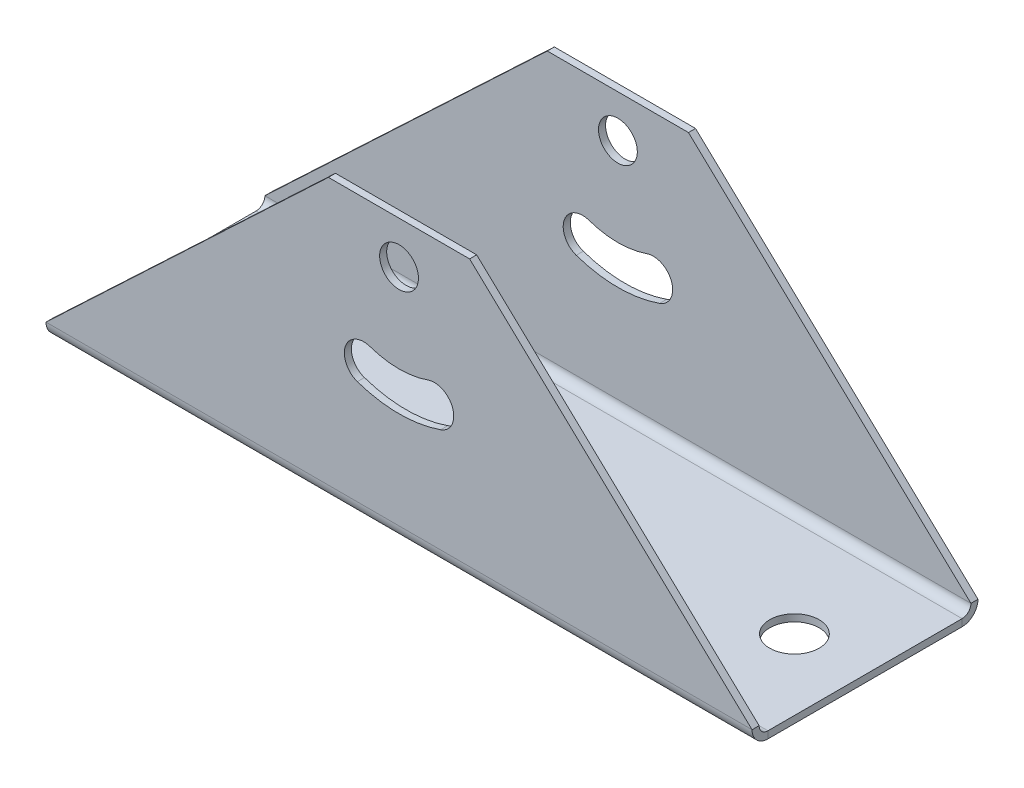
ISO-10303-21;
HEADER;
FILE_DESCRIPTION(('STEP AP214'),'2;1');
FILE_NAME('part.step','',(''),(''),'','','');
FILE_SCHEMA(('AUTOMOTIVE_DESIGN { 1 0 10303 214 1 1 1 1 }'));
ENDSEC;
DATA;
#1=APPLICATION_CONTEXT('core data for automotive mechanical design processes');
#2=APPLICATION_PROTOCOL_DEFINITION('international standard','automotive_design',2000,#1);
#3=PRODUCT_CONTEXT('',#1,'mechanical');
#4=PRODUCT('Part','Part','',(#3));
#5=PRODUCT_RELATED_PRODUCT_CATEGORY('part','',(#4));
#6=PRODUCT_DEFINITION_FORMATION('','',#4);
#7=PRODUCT_DEFINITION_CONTEXT('part definition',#1,'design');
#8=PRODUCT_DEFINITION('design','',#6,#7);
#9=PRODUCT_DEFINITION_SHAPE('','',#8);
#10=(LENGTH_UNIT() NAMED_UNIT(*) SI_UNIT(.MILLI.,.METRE.));
#11=(NAMED_UNIT(*) PLANE_ANGLE_UNIT() SI_UNIT($,.RADIAN.));
#12=(NAMED_UNIT(*) SI_UNIT($,.STERADIAN.) SOLID_ANGLE_UNIT());
#13=UNCERTAINTY_MEASURE_WITH_UNIT(LENGTH_MEASURE(1.E-05),#10,'distance_accuracy_value','');
#14=(GEOMETRIC_REPRESENTATION_CONTEXT(3) GLOBAL_UNCERTAINTY_ASSIGNED_CONTEXT((#13)) GLOBAL_UNIT_ASSIGNED_CONTEXT((#10,
#11,#12)) REPRESENTATION_CONTEXT('',''));
#15=CARTESIAN_POINT('',(0.,0.,0.));
#16=DIRECTION('',(0.,0.,1.));
#17=DIRECTION('',(1.,0.,0.));
#18=AXIS2_PLACEMENT_3D('',#15,#16,#17);
#19=CARTESIAN_POINT('',(0.,0.,32.));
#20=DIRECTION('',(0.,0.,1.));
#21=DIRECTION('',(0.,-1.,0.));
#22=AXIS2_PLACEMENT_3D('',#19,#20,#21);
#23=PLANE('',#22);
#24=CARTESIAN_POINT('',(-10.,37.1859409315523,32.));
#25=DIRECTION('',(0.,0.,1.));
#26=DIRECTION('',(1.,0.,0.));
#27=AXIS2_PLACEMENT_3D('',#24,#25,#26);
#28=CIRCLE('',#27,5.5);
#29=CARTESIAN_POINT('',(-8.19672131147531,42.3819187963543,32.));
#30=VERTEX_POINT('',#29);
#31=CARTESIAN_POINT('',(-11.8032786885245,31.9899630667502,32.));
#32=VERTEX_POINT('',#31);
#33=EDGE_CURVE('E101',#30,#32,#28,.T.);
#34=ORIENTED_EDGE('',*,*,#33,.F.);
#35=CARTESIAN_POINT('',(0.,65.9999999999998,32.));
#36=DIRECTION('',(0.,0.,-1.));
#37=DIRECTION('',(1.,0.,0.));
#38=AXIS2_PLACEMENT_3D('',#35,#36,#37);
#39=CIRCLE('',#38,25.);
#40=CARTESIAN_POINT('',(8.19672131147531,42.3819187963543,32.));
#41=VERTEX_POINT('',#40);
#42=EDGE_CURVE('E249',#41,#30,#39,.T.);
#43=ORIENTED_EDGE('',*,*,#42,.F.);
#44=CARTESIAN_POINT('',(10.,37.1859409315523,32.));
#45=DIRECTION('',(0.,0.,1.));
#46=DIRECTION('',(1.,0.,0.));
#47=AXIS2_PLACEMENT_3D('',#44,#45,#46);
#48=CIRCLE('',#47,5.5);
#49=CARTESIAN_POINT('',(11.8032786885245,31.9899630667502,32.));
#50=VERTEX_POINT('',#49);
#51=EDGE_CURVE('E252',#50,#41,#48,.T.);
#52=ORIENTED_EDGE('',*,*,#51,.F.);
#53=CARTESIAN_POINT('',(0.,65.9999999999998,32.));
#54=DIRECTION('',(0.,0.,1.));
#55=DIRECTION('',(1.,0.,0.));
#56=AXIS2_PLACEMENT_3D('',#53,#54,#55);
#57=CIRCLE('',#56,36.);
#58=EDGE_CURVE('E261',#32,#50,#57,.T.);
#59=ORIENTED_EDGE('',*,*,#58,.F.);
#60=EDGE_LOOP('',(#34,#43,#52,#59));
#61=FACE_BOUND('',#60,.T.);
#62=CARTESIAN_POINT('',(0.,65.9999999999998,32.));
#63=DIRECTION('',(0.,0.,1.));
#64=DIRECTION('',(1.,0.,0.));
#65=AXIS2_PLACEMENT_3D('',#62,#63,#64);
#66=CIRCLE('',#65,5.5);
#67=CARTESIAN_POINT('',(5.5,65.9999999999998,32.));
#68=VERTEX_POINT('',#67);
#69=EDGE_CURVE('E285',#68,#68,#66,.T.);
#70=ORIENTED_EDGE('',*,*,#69,.F.);
#71=EDGE_LOOP('',(#70));
#72=FACE_BOUND('',#71,.T.);
#73=DIRECTION('',(1.,0.,0.));
#74=VECTOR('',#73,1.);
#75=CARTESIAN_POINT('',(0.,2.49999999999995,32.));
#76=LINE('',#75,#74);
#77=CARTESIAN_POINT('',(-99.9999999999996,2.49999999999995,32.));
#78=VERTEX_POINT('',#77);
#79=CARTESIAN_POINT('',(100.,2.49999999999995,32.));
#80=VERTEX_POINT('',#79);
#81=EDGE_CURVE('E373',#78,#80,#76,.T.);
#82=ORIENTED_EDGE('',*,*,#81,.T.);
#83=DIRECTION('',(-0.727265214241139,0.686356545940075,0.));
#84=VECTOR('',#83,1.);
#85=CARTESIAN_POINT('',(100.,2.49999999999995,32.));
#86=LINE('',#85,#84);
#87=CARTESIAN_POINT('',(20.,77.9999999999998,32.));
#88=VERTEX_POINT('',#87);
#89=EDGE_CURVE('E295',#80,#88,#86,.T.);
#90=ORIENTED_EDGE('',*,*,#89,.T.);
#91=DIRECTION('',(1.,0.,0.));
#92=VECTOR('',#91,1.);
#93=CARTESIAN_POINT('',(100.,77.9999999999998,32.0000000000002));
#94=LINE('',#93,#92);
#95=CARTESIAN_POINT('',(-19.9999999999997,77.9999999999998,32.0000000000002));
#96=VERTEX_POINT('',#95);
#97=EDGE_CURVE('E366',#96,#88,#94,.T.);
#98=ORIENTED_EDGE('',*,*,#97,.F.);
#99=DIRECTION('',(0.727265214241139,0.686356545940075,0.));
#100=VECTOR('',#99,1.);
#101=CARTESIAN_POINT('',(-99.9999999999996,2.49999999999995,32.));
#102=LINE('',#101,#100);
#103=EDGE_CURVE('E309',#78,#96,#102,.T.);
#104=ORIENTED_EDGE('',*,*,#103,.F.);
#105=EDGE_LOOP('',(#82,#90,#98,#104));
#106=FACE_BOUND('',#105,.T.);
#107=ADVANCED_FACE('F86',(#61,#72,#106),#23,.T.);
#108=CARTESIAN_POINT('',(0.,0.,30.));
#109=DIRECTION('',(0.,0.,1.));
#110=DIRECTION('',(0.,-1.,0.));
#111=AXIS2_PLACEMENT_3D('',#108,#109,#110);
#112=PLANE('',#111);
#113=CARTESIAN_POINT('',(0.,65.9999999999998,30.0000000000002));
#114=DIRECTION('',(0.,0.,1.));
#115=DIRECTION('',(0.,-1.,0.));
#116=AXIS2_PLACEMENT_3D('',#113,#114,#115);
#117=CIRCLE('',#116,25.);
#118=CARTESIAN_POINT('',(8.19672131147531,42.3819187963543,30.));
#119=VERTEX_POINT('',#118);
#120=CARTESIAN_POINT('',(-8.19672131147531,42.3819187963543,30.));
#121=VERTEX_POINT('',#120);
#122=EDGE_CURVE('E279',#119,#121,#117,.F.);
#123=ORIENTED_EDGE('',*,*,#122,.T.);
#124=CARTESIAN_POINT('',(-10.,37.1859409315523,30.));
#125=DIRECTION('',(0.,0.,1.));
#126=DIRECTION('',(0.,-1.,0.));
#127=AXIS2_PLACEMENT_3D('',#124,#125,#126);
#128=CIRCLE('',#127,5.5);
#129=CARTESIAN_POINT('',(-11.8032786885245,31.9899630667502,30.));
#130=VERTEX_POINT('',#129);
#131=EDGE_CURVE('E282',#121,#130,#128,.T.);
#132=ORIENTED_EDGE('',*,*,#131,.T.);
#133=CARTESIAN_POINT('',(0.,65.9999999999998,30.0000000000002));
#134=DIRECTION('',(0.,0.,1.));
#135=DIRECTION('',(0.,-1.,0.));
#136=AXIS2_PLACEMENT_3D('',#133,#134,#135);
#137=CIRCLE('',#136,36.);
#138=CARTESIAN_POINT('',(11.8032786885245,31.9899630667502,30.));
#139=VERTEX_POINT('',#138);
#140=EDGE_CURVE('E267',#130,#139,#137,.T.);
#141=ORIENTED_EDGE('',*,*,#140,.T.);
#142=CARTESIAN_POINT('',(10.,37.1859409315523,30.));
#143=DIRECTION('',(0.,0.,1.));
#144=DIRECTION('',(0.,-1.,0.));
#145=AXIS2_PLACEMENT_3D('',#142,#143,#144);
#146=CIRCLE('',#145,5.5);
#147=EDGE_CURVE('E276',#139,#119,#146,.T.);
#148=ORIENTED_EDGE('',*,*,#147,.T.);
#149=EDGE_LOOP('',(#123,#132,#141,#148));
#150=FACE_BOUND('',#149,.T.);
#151=CARTESIAN_POINT('',(0.,65.9999999999998,30.0000000000002));
#152=DIRECTION('',(0.,0.,1.));
#153=DIRECTION('',(0.,-1.,0.));
#154=AXIS2_PLACEMENT_3D('',#151,#152,#153);
#155=CIRCLE('',#154,5.5);
#156=CARTESIAN_POINT('',(0.,60.4999999999998,30.0000000000002));
#157=VERTEX_POINT('',#156);
#158=EDGE_CURVE('E292',#157,#157,#155,.T.);
#159=ORIENTED_EDGE('',*,*,#158,.T.);
#160=EDGE_LOOP('',(#159));
#161=FACE_BOUND('',#160,.T.);
#162=DIRECTION('',(-0.727265214241139,0.686356545940075,0.));
#163=VECTOR('',#162,1.);
#164=CARTESIAN_POINT('',(48.3564389165514,51.2386107725047,30.0000000000002));
#165=LINE('',#164,#163);
#166=CARTESIAN_POINT('',(100.,2.49999999999995,30.));
#167=VERTEX_POINT('',#166);
#168=CARTESIAN_POINT('',(20.,77.9999999999998,30.0000000000002));
#169=VERTEX_POINT('',#168);
#170=EDGE_CURVE('E306',#167,#169,#165,.T.);
#171=ORIENTED_EDGE('',*,*,#170,.F.);
#172=DIRECTION('',(-1.,0.,0.));
#173=VECTOR('',#172,1.);
#174=CARTESIAN_POINT('',(-99.9999999999996,2.49999999999995,30.));
#175=LINE('',#174,#173);
#176=CARTESIAN_POINT('',(-99.9999999999996,2.49999999999995,30.));
#177=VERTEX_POINT('',#176);
#178=EDGE_CURVE('E379',#177,#167,#175,.F.);
#179=ORIENTED_EDGE('',*,*,#178,.F.);
#180=DIRECTION('',(0.727265214241139,0.686356545940075,0.));
#181=VECTOR('',#180,1.);
#182=CARTESIAN_POINT('',(-48.3564389165511,51.2386107725047,30.0000000000003));
#183=LINE('',#182,#181);
#184=CARTESIAN_POINT('',(-19.9999999999997,77.9999999999998,30.0000000000002));
#185=VERTEX_POINT('',#184);
#186=EDGE_CURVE('E321',#177,#185,#183,.T.);
#187=ORIENTED_EDGE('',*,*,#186,.T.);
#188=DIRECTION('',(-1.,0.,0.));
#189=VECTOR('',#188,1.);
#190=CARTESIAN_POINT('',(0.,77.9999999999998,30.0000000000002));
#191=LINE('',#190,#189);
#192=EDGE_CURVE('E370',#185,#169,#191,.F.);
#193=ORIENTED_EDGE('',*,*,#192,.T.);
#194=EDGE_LOOP('',(#171,#179,#187,#193));
#195=FACE_BOUND('',#194,.T.);
#196=ADVANCED_FACE('F450',(#150,#161,#195),#112,.F.);
#197=CARTESIAN_POINT('',(100.,77.9999999999998,32.0000000000002));
#198=DIRECTION('',(0.,1.,0.));
#199=DIRECTION('',(0.,0.,1.));
#200=AXIS2_PLACEMENT_3D('',#197,#198,#199);
#201=PLANE('',#200);
#202=ORIENTED_EDGE('',*,*,#97,.T.);
#203=DIRECTION('',(0.,0.,1.));
#204=VECTOR('',#203,1.);
#205=CARTESIAN_POINT('',(20.,77.999999999999,-32.));
#206=LINE('',#205,#204);
#207=EDGE_CURVE('E298',#169,#88,#206,.T.);
#208=ORIENTED_EDGE('',*,*,#207,.F.);
#209=ORIENTED_EDGE('',*,*,#192,.F.);
#210=DIRECTION('',(0.,0.,1.));
#211=VECTOR('',#210,1.);
#212=CARTESIAN_POINT('',(-19.9999999999997,77.999999999999,-32.));
#213=LINE('',#212,#211);
#214=EDGE_CURVE('E313',#185,#96,#213,.T.);
#215=ORIENTED_EDGE('',*,*,#214,.T.);
#216=EDGE_LOOP('',(#202,#208,#209,#215));
#217=FACE_BOUND('',#216,.T.);
#218=ADVANCED_FACE('F456',(#217),#201,.T.);
#219=CARTESIAN_POINT('',(0.,-8.88178419700125E-13,-32.));
#220=DIRECTION('',(0.,0.,-1.));
#221=DIRECTION('',(-1.,0.,0.));
#222=AXIS2_PLACEMENT_3D('',#219,#220,#221);
#223=PLANE('',#222);
#224=CARTESIAN_POINT('',(-10.,37.1859409315514,-32.));
#225=DIRECTION('',(0.,0.,1.));
#226=DIRECTION('',(1.,0.,0.));
#227=AXIS2_PLACEMENT_3D('',#224,#225,#226);
#228=CIRCLE('',#227,5.5);
#229=CARTESIAN_POINT('',(-8.19672131147531,42.3819187963534,-32.));
#230=VERTEX_POINT('',#229);
#231=CARTESIAN_POINT('',(-11.8032786885245,31.9899630667493,-32.));
#232=VERTEX_POINT('',#231);
#233=EDGE_CURVE('E229',#230,#232,#228,.T.);
#234=ORIENTED_EDGE('',*,*,#233,.T.);
#235=CARTESIAN_POINT('',(0.,65.9999999999989,-32.));
#236=DIRECTION('',(0.,0.,1.));
#237=DIRECTION('',(1.,0.,0.));
#238=AXIS2_PLACEMENT_3D('',#235,#236,#237);
#239=CIRCLE('',#238,36.);
#240=CARTESIAN_POINT('',(11.8032786885245,31.9899630667493,-32.));
#241=VERTEX_POINT('',#240);
#242=EDGE_CURVE('E237',#232,#241,#239,.T.);
#243=ORIENTED_EDGE('',*,*,#242,.T.);
#244=CARTESIAN_POINT('',(10.,37.1859409315514,-32.));
#245=DIRECTION('',(0.,0.,1.));
#246=DIRECTION('',(1.,0.,0.));
#247=AXIS2_PLACEMENT_3D('',#244,#245,#246);
#248=CIRCLE('',#247,5.5);
#249=CARTESIAN_POINT('',(8.19672131147531,42.3819187963534,-32.));
#250=VERTEX_POINT('',#249);
#251=EDGE_CURVE('E243',#241,#250,#248,.T.);
#252=ORIENTED_EDGE('',*,*,#251,.T.);
#253=CARTESIAN_POINT('',(0.,65.9999999999989,-32.));
#254=DIRECTION('',(0.,0.,-1.));
#255=DIRECTION('',(1.,0.,0.));
#256=AXIS2_PLACEMENT_3D('',#253,#254,#255);
#257=CIRCLE('',#256,25.);
#258=EDGE_CURVE('E248',#250,#230,#257,.T.);
#259=ORIENTED_EDGE('',*,*,#258,.T.);
#260=EDGE_LOOP('',(#234,#243,#252,#259));
#261=FACE_BOUND('',#260,.T.);
#262=CARTESIAN_POINT('',(0.,65.9999999999989,-32.));
#263=DIRECTION('',(0.,0.,1.));
#264=DIRECTION('',(1.,0.,0.));
#265=AXIS2_PLACEMENT_3D('',#262,#263,#264);
#266=CIRCLE('',#265,5.5);
#267=CARTESIAN_POINT('',(5.5,65.9999999999989,-32.));
#268=VERTEX_POINT('',#267);
#269=EDGE_CURVE('E286',#268,#268,#266,.T.);
#270=ORIENTED_EDGE('',*,*,#269,.T.);
#271=EDGE_LOOP('',(#270));
#272=FACE_BOUND('',#271,.T.);
#273=DIRECTION('',(-1.,0.,0.));
#274=VECTOR('',#273,1.);
#275=CARTESIAN_POINT('',(-99.9999999999996,77.999999999999,-32.));
#276=LINE('',#275,#274);
#277=CARTESIAN_POINT('',(20.,77.999999999999,-32.));
#278=VERTEX_POINT('',#277);
#279=CARTESIAN_POINT('',(-19.9999999999997,77.999999999999,-32.));
#280=VERTEX_POINT('',#279);
#281=EDGE_CURVE('E325',#278,#280,#276,.T.);
#282=ORIENTED_EDGE('',*,*,#281,.F.);
#283=DIRECTION('',(-0.727265214241139,0.686356545940075,0.));
#284=VECTOR('',#283,1.);
#285=CARTESIAN_POINT('',(100.,2.49999999999906,-32.));
#286=LINE('',#285,#284);
#287=CARTESIAN_POINT('',(100.,2.49999999999906,-32.));
#288=VERTEX_POINT('',#287);
#289=EDGE_CURVE('E296',#288,#278,#286,.T.);
#290=ORIENTED_EDGE('',*,*,#289,.F.);
#291=DIRECTION('',(-1.,0.,0.));
#292=VECTOR('',#291,1.);
#293=CARTESIAN_POINT('',(0.,2.49999999999906,-32.));
#294=LINE('',#293,#292);
#295=CARTESIAN_POINT('',(-99.9999999999996,2.49999999999906,-32.));
#296=VERTEX_POINT('',#295);
#297=EDGE_CURVE('E330',#288,#296,#294,.T.);
#298=ORIENTED_EDGE('',*,*,#297,.T.);
#299=DIRECTION('',(0.727265214241139,0.686356545940075,0.));
#300=VECTOR('',#299,1.);
#301=CARTESIAN_POINT('',(-99.9999999999996,2.49999999999906,-32.));
#302=LINE('',#301,#300);
#303=EDGE_CURVE('E310',#296,#280,#302,.T.);
#304=ORIENTED_EDGE('',*,*,#303,.T.);
#305=EDGE_LOOP('',(#282,#290,#298,#304));
#306=FACE_BOUND('',#305,.T.);
#307=ADVANCED_FACE('F245',(#261,#272,#306),#223,.T.);
#308=CARTESIAN_POINT('',(0.,-8.88178419700125E-13,-30.));
#309=DIRECTION('',(0.,0.,-1.));
#310=DIRECTION('',(-1.,0.,0.));
#311=AXIS2_PLACEMENT_3D('',#308,#309,#310);
#312=PLANE('',#311);
#313=CARTESIAN_POINT('',(0.,65.9999999999989,-30.));
#314=DIRECTION('',(0.,0.,-1.));
#315=DIRECTION('',(-1.,0.,0.));
#316=AXIS2_PLACEMENT_3D('',#313,#314,#315);
#317=CIRCLE('',#316,36.);
#318=CARTESIAN_POINT('',(11.8032786885245,31.9899630667493,-30.));
#319=VERTEX_POINT('',#318);
#320=CARTESIAN_POINT('',(-11.8032786885245,31.9899630667493,-30.));
#321=VERTEX_POINT('',#320);
#322=EDGE_CURVE('E416',#319,#321,#317,.T.);
#323=ORIENTED_EDGE('',*,*,#322,.T.);
#324=CARTESIAN_POINT('',(-10.,37.1859409315514,-30.));
#325=DIRECTION('',(0.,0.,-1.));
#326=DIRECTION('',(-1.,0.,0.));
#327=AXIS2_PLACEMENT_3D('',#324,#325,#326);
#328=CIRCLE('',#327,5.5);
#329=CARTESIAN_POINT('',(-8.19672131147531,42.3819187963534,-30.));
#330=VERTEX_POINT('',#329);
#331=EDGE_CURVE('E13',#321,#330,#328,.T.);
#332=ORIENTED_EDGE('',*,*,#331,.T.);
#333=CARTESIAN_POINT('',(0.,65.9999999999989,-30.));
#334=DIRECTION('',(0.,0.,-1.));
#335=DIRECTION('',(-1.,0.,0.));
#336=AXIS2_PLACEMENT_3D('',#333,#334,#335);
#337=CIRCLE('',#336,25.);
#338=CARTESIAN_POINT('',(8.19672131147531,42.3819187963534,-30.));
#339=VERTEX_POINT('',#338);
#340=EDGE_CURVE('E94',#330,#339,#337,.F.);
#341=ORIENTED_EDGE('',*,*,#340,.T.);
#342=CARTESIAN_POINT('',(10.,37.1859409315514,-30.));
#343=DIRECTION('',(0.,0.,-1.));
#344=DIRECTION('',(-1.,0.,0.));
#345=AXIS2_PLACEMENT_3D('',#342,#343,#344);
#346=CIRCLE('',#345,5.5);
#347=EDGE_CURVE('E425',#339,#319,#346,.T.);
#348=ORIENTED_EDGE('',*,*,#347,.T.);
#349=EDGE_LOOP('',(#323,#332,#341,#348));
#350=FACE_BOUND('',#349,.T.);
#351=CARTESIAN_POINT('',(0.,65.9999999999989,-30.));
#352=DIRECTION('',(0.,0.,-1.));
#353=DIRECTION('',(-1.,0.,0.));
#354=AXIS2_PLACEMENT_3D('',#351,#352,#353);
#355=CIRCLE('',#354,5.5);
#356=CARTESIAN_POINT('',(-5.5,65.9999999999989,-30.));
#357=VERTEX_POINT('',#356);
#358=EDGE_CURVE('E289',#357,#357,#355,.T.);
#359=ORIENTED_EDGE('',*,*,#358,.T.);
#360=EDGE_LOOP('',(#359));
#361=FACE_BOUND('',#360,.T.);
#362=DIRECTION('',(0.727265214241139,-0.686356545940075,0.));
#363=VECTOR('',#362,1.);
#364=CARTESIAN_POINT('',(48.3564389165514,51.2386107725038,-30.));
#365=LINE('',#364,#363);
#366=CARTESIAN_POINT('',(20.,77.999999999999,-30.));
#367=VERTEX_POINT('',#366);
#368=CARTESIAN_POINT('',(100.,2.49999999999906,-30.));
#369=VERTEX_POINT('',#368);
#370=EDGE_CURVE('E304',#367,#369,#365,.T.);
#371=ORIENTED_EDGE('',*,*,#370,.F.);
#372=DIRECTION('',(1.,0.,0.));
#373=VECTOR('',#372,1.);
#374=CARTESIAN_POINT('',(0.,77.999999999999,-30.));
#375=LINE('',#374,#373);
#376=CARTESIAN_POINT('',(-19.9999999999997,77.999999999999,-30.));
#377=VERTEX_POINT('',#376);
#378=EDGE_CURVE('E328',#367,#377,#375,.F.);
#379=ORIENTED_EDGE('',*,*,#378,.T.);
#380=DIRECTION('',(-0.727265214241139,-0.686356545940075,0.));
#381=VECTOR('',#380,1.);
#382=CARTESIAN_POINT('',(-48.3564389165509,51.2386107725038,-30.));
#383=LINE('',#382,#381);
#384=CARTESIAN_POINT('',(-99.9999999999996,2.49999999999906,-30.));
#385=VERTEX_POINT('',#384);
#386=EDGE_CURVE('E318',#377,#385,#383,.T.);
#387=ORIENTED_EDGE('',*,*,#386,.T.);
#388=DIRECTION('',(1.,0.,0.));
#389=VECTOR('',#388,1.);
#390=CARTESIAN_POINT('',(100.,2.49999999999906,-30.));
#391=LINE('',#390,#389);
#392=EDGE_CURVE('E336',#369,#385,#391,.F.);
#393=ORIENTED_EDGE('',*,*,#392,.F.);
#394=EDGE_LOOP('',(#371,#379,#387,#393));
#395=FACE_BOUND('',#394,.T.);
#396=ADVANCED_FACE('F429',(#350,#361,#395),#312,.F.);
#397=CARTESIAN_POINT('',(-99.9999999999996,77.999999999999,-32.));
#398=DIRECTION('',(0.,1.,0.));
#399=DIRECTION('',(0.,0.,1.));
#400=AXIS2_PLACEMENT_3D('',#397,#398,#399);
#401=PLANE('',#400);
#402=ORIENTED_EDGE('',*,*,#378,.F.);
#403=EDGE_CURVE('E302',#278,#367,#206,.T.);
#404=ORIENTED_EDGE('',*,*,#403,.F.);
#405=ORIENTED_EDGE('',*,*,#281,.T.);
#406=EDGE_CURVE('E315',#280,#377,#213,.T.);
#407=ORIENTED_EDGE('',*,*,#406,.T.);
#408=EDGE_LOOP('',(#402,#404,#405,#407));
#409=FACE_BOUND('',#408,.T.);
#410=ADVANCED_FACE('F488',(#409),#401,.T.);
#411=CARTESIAN_POINT('',(0.,-2.00000000000022,0.));
#412=DIRECTION('',(0.,-1.,0.));
#413=DIRECTION('',(0.,0.,-1.));
#414=AXIS2_PLACEMENT_3D('',#411,#412,#413);
#415=PLANE('',#414);
#416=CARTESIAN_POINT('',(-79.9999999999996,-1.99999999999978,0.));
#417=DIRECTION('',(0.,-1.,0.));
#418=DIRECTION('',(0.,0.,-1.));
#419=AXIS2_PLACEMENT_3D('',#416,#417,#418);
#420=CIRCLE('',#419,7.);
#421=CARTESIAN_POINT('',(-79.9999999999996,-1.99999999999978,-7.));
#422=VERTEX_POINT('',#421);
#423=EDGE_CURVE('E255',#422,#422,#420,.T.);
#424=ORIENTED_EDGE('',*,*,#423,.F.);
#425=EDGE_LOOP('',(#424));
#426=FACE_BOUND('',#425,.T.);
#427=CARTESIAN_POINT('',(80.0000000000001,-2.00000000000022,0.));
#428=DIRECTION('',(0.,-1.,0.));
#429=DIRECTION('',(0.,0.,-1.));
#430=AXIS2_PLACEMENT_3D('',#427,#428,#429);
#431=CIRCLE('',#430,7.00000000000002);
#432=CARTESIAN_POINT('',(80.0000000000001,-2.00000000000022,-7.00000000000002));
#433=VERTEX_POINT('',#432);
#434=EDGE_CURVE('E865',#433,#433,#431,.T.);
#435=ORIENTED_EDGE('',*,*,#434,.F.);
#436=EDGE_LOOP('',(#435));
#437=FACE_BOUND('',#436,.T.);
#438=DIRECTION('',(0.,0.,1.));
#439=VECTOR('',#438,1.);
#440=CARTESIAN_POINT('',(-99.9999999999996,-2.00000000000022,32.));
#441=LINE('',#440,#439);
#442=CARTESIAN_POINT('',(-99.9999999999996,-2.00000000000067,-27.5000000000001));
#443=VERTEX_POINT('',#442);
#444=CARTESIAN_POINT('',(-99.9999999999996,-2.00000000000022,27.5000000000001));
#445=VERTEX_POINT('',#444);
#446=EDGE_CURVE('E412',#443,#445,#441,.T.);
#447=ORIENTED_EDGE('',*,*,#446,.F.);
#448=DIRECTION('',(-1.,0.,0.));
#449=VECTOR('',#448,1.);
#450=CARTESIAN_POINT('',(-99.9999999999996,-2.00000000000067,-27.5000000000001));
#451=LINE('',#450,#449);
#452=CARTESIAN_POINT('',(100.,-2.00000000000067,-27.5000000000001));
#453=VERTEX_POINT('',#452);
#454=EDGE_CURVE('E341',#443,#453,#451,.F.);
#455=ORIENTED_EDGE('',*,*,#454,.T.);
#456=DIRECTION('',(0.,0.,-1.));
#457=VECTOR('',#456,1.);
#458=CARTESIAN_POINT('',(100.,-2.00000000000022,32.));
#459=LINE('',#458,#457);
#460=CARTESIAN_POINT('',(100.,-2.00000000000022,27.5000000000001));
#461=VERTEX_POINT('',#460);
#462=EDGE_CURVE('E408',#461,#453,#459,.T.);
#463=ORIENTED_EDGE('',*,*,#462,.F.);
#464=DIRECTION('',(1.,0.,0.));
#465=VECTOR('',#464,1.);
#466=CARTESIAN_POINT('',(100.,-2.00000000000022,27.5000000000001));
#467=LINE('',#466,#465);
#468=EDGE_CURVE('E383',#461,#445,#467,.F.);
#469=ORIENTED_EDGE('',*,*,#468,.T.);
#470=EDGE_LOOP('',(#447,#455,#463,#469));
#471=FACE_BOUND('',#470,.T.);
#472=ADVANCED_FACE('F484',(#426,#437,#471),#415,.T.);
#473=CARTESIAN_POINT('',(0.,0.,0.));
#474=DIRECTION('',(0.,-1.,0.));
#475=DIRECTION('',(0.,0.,-1.));
#476=AXIS2_PLACEMENT_3D('',#473,#474,#475);
#477=PLANE('',#476);
#478=CARTESIAN_POINT('',(-79.9999999999996,0.,0.));
#479=DIRECTION('',(0.,1.,0.));
#480=DIRECTION('',(0.,0.,1.));
#481=AXIS2_PLACEMENT_3D('',#478,#479,#480);
#482=CIRCLE('',#481,7.);
#483=CARTESIAN_POINT('',(-79.9999999999996,0.,7.00000000000001));
#484=VERTEX_POINT('',#483);
#485=EDGE_CURVE('E864',#484,#484,#482,.T.);
#486=ORIENTED_EDGE('',*,*,#485,.F.);
#487=EDGE_LOOP('',(#486));
#488=FACE_BOUND('',#487,.T.);
#489=CARTESIAN_POINT('',(80.0000000000001,0.,0.));
#490=DIRECTION('',(0.,1.,0.));
#491=DIRECTION('',(0.,0.,1.));
#492=AXIS2_PLACEMENT_3D('',#489,#490,#491);
#493=CIRCLE('',#492,7.00000000000002);
#494=CARTESIAN_POINT('',(80.0000000000001,0.,7.00000000000002));
#495=VERTEX_POINT('',#494);
#496=EDGE_CURVE('E866',#495,#495,#493,.T.);
#497=ORIENTED_EDGE('',*,*,#496,.F.);
#498=EDGE_LOOP('',(#497));
#499=FACE_BOUND('',#498,.T.);
#500=DIRECTION('',(-1.,0.,0.));
#501=VECTOR('',#500,1.);
#502=CARTESIAN_POINT('',(-99.9999999999996,-8.88178419700125E-13,-27.5000000000001));
#503=LINE('',#502,#501);
#504=CARTESIAN_POINT('',(-99.9999999999996,-8.88178419700125E-13,-27.5000000000001));
#505=VERTEX_POINT('',#504);
#506=CARTESIAN_POINT('',(100.,-8.88178419700125E-13,-27.5000000000001));
#507=VERTEX_POINT('',#506);
#508=EDGE_CURVE('E355',#505,#507,#503,.F.);
#509=ORIENTED_EDGE('',*,*,#508,.F.);
#510=DIRECTION('',(0.,0.,1.));
#511=VECTOR('',#510,1.);
#512=CARTESIAN_POINT('',(-99.9999999999996,0.,32.));
#513=LINE('',#512,#511);
#514=CARTESIAN_POINT('',(-99.9999999999996,0.,27.5000000000001));
#515=VERTEX_POINT('',#514);
#516=EDGE_CURVE('E413',#505,#515,#513,.T.);
#517=ORIENTED_EDGE('',*,*,#516,.T.);
#518=DIRECTION('',(1.,0.,0.));
#519=VECTOR('',#518,1.);
#520=CARTESIAN_POINT('',(100.,0.,27.5000000000001));
#521=LINE('',#520,#519);
#522=CARTESIAN_POINT('',(100.,0.,27.5000000000001));
#523=VERTEX_POINT('',#522);
#524=EDGE_CURVE('E397',#523,#515,#521,.F.);
#525=ORIENTED_EDGE('',*,*,#524,.F.);
#526=DIRECTION('',(0.,0.,-1.));
#527=VECTOR('',#526,1.);
#528=CARTESIAN_POINT('',(100.,0.,32.));
#529=LINE('',#528,#527);
#530=EDGE_CURVE('E405',#523,#507,#529,.T.);
#531=ORIENTED_EDGE('',*,*,#530,.T.);
#532=EDGE_LOOP('',(#509,#517,#525,#531));
#533=FACE_BOUND('',#532,.T.);
#534=ADVANCED_FACE('F487',(#488,#499,#533),#477,.F.);
#535=CARTESIAN_POINT('',(-99.9999999999996,-2.00000000000022,32.));
#536=DIRECTION('',(-1.,0.,0.));
#537=DIRECTION('',(0.,0.,1.));
#538=AXIS2_PLACEMENT_3D('',#535,#536,#537);
#539=PLANE('',#538);
#540=ORIENTED_EDGE('',*,*,#516,.F.);
#541=DIRECTION('',(0.,-1.,0.));
#542=VECTOR('',#541,1.);
#543=CARTESIAN_POINT('',(-99.9999999999996,-8.88178419700125E-13,-27.5000000000001));
#544=LINE('',#543,#542);
#545=EDGE_CURVE('E349',#505,#443,#544,.T.);
#546=ORIENTED_EDGE('',*,*,#545,.T.);
#547=ORIENTED_EDGE('',*,*,#446,.T.);
#548=DIRECTION('',(0.,-1.,0.));
#549=VECTOR('',#548,1.);
#550=CARTESIAN_POINT('',(-99.9999999999996,0.,27.5000000000001));
#551=LINE('',#550,#549);
#552=EDGE_CURVE('E402',#515,#445,#551,.T.);
#553=ORIENTED_EDGE('',*,*,#552,.F.);
#554=EDGE_LOOP('',(#540,#546,#547,#553));
#555=FACE_BOUND('',#554,.T.);
#556=ADVANCED_FACE('F491',(#555),#539,.T.);
#557=CARTESIAN_POINT('',(100.,-2.00000000000022,32.));
#558=DIRECTION('',(1.,0.,0.));
#559=DIRECTION('',(0.,0.,-1.));
#560=AXIS2_PLACEMENT_3D('',#557,#558,#559);
#561=PLANE('',#560);
#562=DIRECTION('',(0.,-1.,0.));
#563=VECTOR('',#562,1.);
#564=CARTESIAN_POINT('',(100.,-8.88178419700125E-13,-27.5000000000001));
#565=LINE('',#564,#563);
#566=EDGE_CURVE('E360',#507,#453,#565,.T.);
#567=ORIENTED_EDGE('',*,*,#566,.F.);
#568=ORIENTED_EDGE('',*,*,#530,.F.);
#569=DIRECTION('',(0.,-1.,0.));
#570=VECTOR('',#569,1.);
#571=CARTESIAN_POINT('',(100.,0.,27.5000000000001));
#572=LINE('',#571,#570);
#573=EDGE_CURVE('E391',#523,#461,#572,.T.);
#574=ORIENTED_EDGE('',*,*,#573,.T.);
#575=ORIENTED_EDGE('',*,*,#462,.T.);
#576=EDGE_LOOP('',(#567,#568,#574,#575));
#577=FACE_BOUND('',#576,.T.);
#578=ADVANCED_FACE('F88',(#577),#561,.T.);
#579=CARTESIAN_POINT('',(-99.9999999999996,2.49999999999995,27.5000000000001));
#580=DIRECTION('',(-1.,0.,0.));
#581=DIRECTION('',(0.,0.,1.));
#582=AXIS2_PLACEMENT_3D('',#579,#580,#581);
#583=PLANE('',#582);
#584=DIRECTION('',(0.,0.,1.));
#585=VECTOR('',#584,1.);
#586=CARTESIAN_POINT('',(-99.9999999999996,2.49999999999995,32.0000000000002));
#587=LINE('',#586,#585);
#588=EDGE_CURVE('E363',#177,#78,#587,.T.);
#589=ORIENTED_EDGE('',*,*,#588,.F.);
#590=CARTESIAN_POINT('',(-99.9999999999996,2.49999999999995,27.5000000000001));
#591=DIRECTION('',(1.,0.,0.));
#592=DIRECTION('',(0.,0.,-1.));
#593=AXIS2_PLACEMENT_3D('',#590,#591,#592);
#594=CIRCLE('',#593,2.5);
#595=EDGE_CURVE('E394',#515,#177,#594,.F.);
#596=ORIENTED_EDGE('',*,*,#595,.F.);
#597=ORIENTED_EDGE('',*,*,#552,.T.);
#598=CARTESIAN_POINT('',(-99.9999999999996,2.49999999999995,27.5000000000001));
#599=DIRECTION('',(1.,0.,0.));
#600=DIRECTION('',(0.,0.,-1.));
#601=AXIS2_PLACEMENT_3D('',#598,#599,#600);
#602=CIRCLE('',#601,4.5);
#603=EDGE_CURVE('E387',#445,#78,#602,.F.);
#604=ORIENTED_EDGE('',*,*,#603,.T.);
#605=EDGE_LOOP('',(#589,#596,#597,#604));
#606=FACE_BOUND('',#605,.T.);
#607=ADVANCED_FACE('F477',(#606),#583,.T.);
#608=CARTESIAN_POINT('',(100.,2.49999999999995,27.5000000000001));
#609=DIRECTION('',(-1.,0.,0.));
#610=DIRECTION('',(0.,0.,1.));
#611=AXIS2_PLACEMENT_3D('',#608,#609,#610);
#612=PLANE('',#611);
#613=CARTESIAN_POINT('',(100.,2.49999999999995,27.5000000000001));
#614=DIRECTION('',(1.,0.,0.));
#615=DIRECTION('',(0.,0.,-1.));
#616=AXIS2_PLACEMENT_3D('',#613,#614,#615);
#617=CIRCLE('',#616,2.5);
#618=EDGE_CURVE('E369',#167,#523,#617,.T.);
#619=ORIENTED_EDGE('',*,*,#618,.F.);
#620=DIRECTION('',(0.,0.,1.));
#621=VECTOR('',#620,1.);
#622=CARTESIAN_POINT('',(100.,2.49999999999995,30.));
#623=LINE('',#622,#621);
#624=EDGE_CURVE('E376',#167,#80,#623,.T.);
#625=ORIENTED_EDGE('',*,*,#624,.T.);
#626=CARTESIAN_POINT('',(100.,2.49999999999995,27.5000000000001));
#627=DIRECTION('',(1.,0.,0.));
#628=DIRECTION('',(0.,0.,-1.));
#629=AXIS2_PLACEMENT_3D('',#626,#627,#628);
#630=CIRCLE('',#629,4.5);
#631=EDGE_CURVE('E388',#80,#461,#630,.T.);
#632=ORIENTED_EDGE('',*,*,#631,.T.);
#633=ORIENTED_EDGE('',*,*,#573,.F.);
#634=EDGE_LOOP('',(#619,#625,#632,#633));
#635=FACE_BOUND('',#634,.T.);
#636=ADVANCED_FACE('F471',(#635),#612,.F.);
#637=CARTESIAN_POINT('',(100.,2.49999999999995,27.5000000000001));
#638=DIRECTION('',(1.,0.,0.));
#639=DIRECTION('',(0.,0.,1.));
#640=AXIS2_PLACEMENT_3D('',#637,#638,#639);
#641=CYLINDRICAL_SURFACE('',#640,4.5);
#642=ORIENTED_EDGE('',*,*,#468,.F.);
#643=ORIENTED_EDGE('',*,*,#631,.F.);
#644=ORIENTED_EDGE('',*,*,#81,.F.);
#645=ORIENTED_EDGE('',*,*,#603,.F.);
#646=EDGE_LOOP('',(#642,#643,#644,#645));
#647=FACE_BOUND('',#646,.T.);
#648=ADVANCED_FACE('F467',(#647),#641,.T.);
#649=CARTESIAN_POINT('',(100.,2.49999999999995,27.5000000000001));
#650=DIRECTION('',(1.,0.,0.));
#651=DIRECTION('',(0.,0.,1.));
#652=AXIS2_PLACEMENT_3D('',#649,#650,#651);
#653=CYLINDRICAL_SURFACE('',#652,2.5);
#654=ORIENTED_EDGE('',*,*,#524,.T.);
#655=ORIENTED_EDGE('',*,*,#595,.T.);
#656=ORIENTED_EDGE('',*,*,#178,.T.);
#657=ORIENTED_EDGE('',*,*,#618,.T.);
#658=EDGE_LOOP('',(#654,#655,#656,#657));
#659=FACE_BOUND('',#658,.T.);
#660=ADVANCED_FACE('F470',(#659),#653,.F.);
#661=CARTESIAN_POINT('',(100.,2.49999999999906,-27.5000000000001));
#662=DIRECTION('',(1.,0.,0.));
#663=DIRECTION('',(0.,0.,-1.));
#664=AXIS2_PLACEMENT_3D('',#661,#662,#663);
#665=PLANE('',#664);
#666=DIRECTION('',(0.,0.,-1.));
#667=VECTOR('',#666,1.);
#668=CARTESIAN_POINT('',(100.,2.49999999999906,-32.0000000000005));
#669=LINE('',#668,#667);
#670=EDGE_CURVE('E324',#369,#288,#669,.T.);
#671=ORIENTED_EDGE('',*,*,#670,.F.);
#672=CARTESIAN_POINT('',(100.,2.49999999999906,-27.5000000000001));
#673=DIRECTION('',(-1.,0.,0.));
#674=DIRECTION('',(0.,0.,1.));
#675=AXIS2_PLACEMENT_3D('',#672,#673,#674);
#676=CIRCLE('',#675,2.5);
#677=EDGE_CURVE('E352',#507,#369,#676,.F.);
#678=ORIENTED_EDGE('',*,*,#677,.F.);
#679=ORIENTED_EDGE('',*,*,#566,.T.);
#680=CARTESIAN_POINT('',(100.,2.49999999999906,-27.5000000000001));
#681=DIRECTION('',(-1.,0.,0.));
#682=DIRECTION('',(0.,0.,1.));
#683=AXIS2_PLACEMENT_3D('',#680,#681,#682);
#684=CIRCLE('',#683,4.5);
#685=EDGE_CURVE('E345',#453,#288,#684,.F.);
#686=ORIENTED_EDGE('',*,*,#685,.T.);
#687=EDGE_LOOP('',(#671,#678,#679,#686));
#688=FACE_BOUND('',#687,.T.);
#689=ADVANCED_FACE('F475',(#688),#665,.T.);
#690=CARTESIAN_POINT('',(-99.9999999999996,2.49999999999906,-27.5000000000001));
#691=DIRECTION('',(1.,0.,0.));
#692=DIRECTION('',(0.,0.,-1.));
#693=AXIS2_PLACEMENT_3D('',#690,#691,#692);
#694=PLANE('',#693);
#695=CARTESIAN_POINT('',(-99.9999999999996,2.49999999999906,-27.5000000000001));
#696=DIRECTION('',(-1.,0.,0.));
#697=DIRECTION('',(0.,0.,1.));
#698=AXIS2_PLACEMENT_3D('',#695,#696,#697);
#699=CIRCLE('',#698,2.5);
#700=EDGE_CURVE('E327',#385,#505,#699,.T.);
#701=ORIENTED_EDGE('',*,*,#700,.F.);
#702=DIRECTION('',(0.,0.,-1.));
#703=VECTOR('',#702,1.);
#704=CARTESIAN_POINT('',(-99.9999999999996,2.49999999999906,-30.));
#705=LINE('',#704,#703);
#706=EDGE_CURVE('E333',#385,#296,#705,.T.);
#707=ORIENTED_EDGE('',*,*,#706,.T.);
#708=CARTESIAN_POINT('',(-99.9999999999996,2.49999999999906,-27.5000000000001));
#709=DIRECTION('',(-1.,0.,0.));
#710=DIRECTION('',(0.,0.,1.));
#711=AXIS2_PLACEMENT_3D('',#708,#709,#710);
#712=CIRCLE('',#711,4.5);
#713=EDGE_CURVE('E346',#296,#443,#712,.T.);
#714=ORIENTED_EDGE('',*,*,#713,.T.);
#715=ORIENTED_EDGE('',*,*,#545,.F.);
#716=EDGE_LOOP('',(#701,#707,#714,#715));
#717=FACE_BOUND('',#716,.T.);
#718=ADVANCED_FACE('F461',(#717),#694,.F.);
#719=CARTESIAN_POINT('',(-99.9999999999996,2.49999999999906,-27.5000000000001));
#720=DIRECTION('',(-1.,0.,0.));
#721=DIRECTION('',(0.,0.,-1.));
#722=AXIS2_PLACEMENT_3D('',#719,#720,#721);
#723=CYLINDRICAL_SURFACE('',#722,4.5);
#724=ORIENTED_EDGE('',*,*,#454,.F.);
#725=ORIENTED_EDGE('',*,*,#713,.F.);
#726=ORIENTED_EDGE('',*,*,#297,.F.);
#727=ORIENTED_EDGE('',*,*,#685,.F.);
#728=EDGE_LOOP('',(#724,#725,#726,#727));
#729=FACE_BOUND('',#728,.T.);
#730=ADVANCED_FACE('F518',(#729),#723,.T.);
#731=CARTESIAN_POINT('',(-99.9999999999996,2.49999999999906,-27.5000000000001));
#732=DIRECTION('',(-1.,0.,0.));
#733=DIRECTION('',(0.,0.,-1.));
#734=AXIS2_PLACEMENT_3D('',#731,#732,#733);
#735=CYLINDRICAL_SURFACE('',#734,2.5);
#736=ORIENTED_EDGE('',*,*,#508,.T.);
#737=ORIENTED_EDGE('',*,*,#677,.T.);
#738=ORIENTED_EDGE('',*,*,#392,.T.);
#739=ORIENTED_EDGE('',*,*,#700,.T.);
#740=EDGE_LOOP('',(#736,#737,#738,#739));
#741=FACE_BOUND('',#740,.T.);
#742=ADVANCED_FACE('F508',(#741),#735,.F.);
#743=CARTESIAN_POINT('',(-99.9999999999996,2.49999999999906,-32.));
#744=DIRECTION('',(0.686356545940075,-0.727265214241139,0.));
#745=DIRECTION('',(0.727265214241139,0.686356545940075,0.));
#746=AXIS2_PLACEMENT_3D('',#743,#744,#745);
#747=PLANE('',#746);
#748=ORIENTED_EDGE('',*,*,#406,.F.);
#749=ORIENTED_EDGE('',*,*,#303,.F.);
#750=ORIENTED_EDGE('',*,*,#706,.F.);
#751=ORIENTED_EDGE('',*,*,#386,.F.);
#752=EDGE_LOOP('',(#748,#749,#750,#751));
#753=FACE_BOUND('',#752,.T.);
#754=ADVANCED_FACE('F534',(#753),#747,.F.);
#755=ORIENTED_EDGE('',*,*,#588,.T.);
#756=ORIENTED_EDGE('',*,*,#103,.T.);
#757=ORIENTED_EDGE('',*,*,#214,.F.);
#758=ORIENTED_EDGE('',*,*,#186,.F.);
#759=EDGE_LOOP('',(#755,#756,#757,#758));
#760=FACE_BOUND('',#759,.T.);
#761=ADVANCED_FACE('F536',(#760),#747,.F.);
#762=CARTESIAN_POINT('',(100.,2.49999999999906,-32.));
#763=DIRECTION('',(0.686356545940075,0.727265214241139,0.));
#764=DIRECTION('',(-0.727265214241139,0.686356545940075,0.));
#765=AXIS2_PLACEMENT_3D('',#762,#763,#764);
#766=PLANE('',#765);
#767=ORIENTED_EDGE('',*,*,#370,.T.);
#768=ORIENTED_EDGE('',*,*,#670,.T.);
#769=ORIENTED_EDGE('',*,*,#289,.T.);
#770=ORIENTED_EDGE('',*,*,#403,.T.);
#771=EDGE_LOOP('',(#767,#768,#769,#770));
#772=FACE_BOUND('',#771,.T.);
#773=ADVANCED_FACE('F528',(#772),#766,.T.);
#774=ORIENTED_EDGE('',*,*,#170,.T.);
#775=ORIENTED_EDGE('',*,*,#207,.T.);
#776=ORIENTED_EDGE('',*,*,#89,.F.);
#777=ORIENTED_EDGE('',*,*,#624,.F.);
#778=EDGE_LOOP('',(#774,#775,#776,#777));
#779=FACE_BOUND('',#778,.T.);
#780=ADVANCED_FACE('F546',(#779),#766,.T.);
#781=CARTESIAN_POINT('',(0.,65.9999999999989,-32.));
#782=DIRECTION('',(0.,0.,1.));
#783=DIRECTION('',(1.,0.,0.));
#784=AXIS2_PLACEMENT_3D('',#781,#782,#783);
#785=CYLINDRICAL_SURFACE('',#784,5.5);
#786=ORIENTED_EDGE('',*,*,#269,.F.);
#787=EDGE_LOOP('',(#786));
#788=FACE_BOUND('',#787,.T.);
#789=ORIENTED_EDGE('',*,*,#358,.F.);
#790=EDGE_LOOP('',(#789));
#791=FACE_BOUND('',#790,.T.);
#792=ADVANCED_FACE('F601',(#788,#791),#785,.F.);
#793=ORIENTED_EDGE('',*,*,#69,.T.);
#794=EDGE_LOOP('',(#793));
#795=FACE_BOUND('',#794,.T.);
#796=ORIENTED_EDGE('',*,*,#158,.F.);
#797=EDGE_LOOP('',(#796));
#798=FACE_BOUND('',#797,.T.);
#799=ADVANCED_FACE('F444',(#795,#798),#785,.F.);
#800=CARTESIAN_POINT('',(0.,65.9999999999989,-32.));
#801=DIRECTION('',(0.,0.,1.));
#802=DIRECTION('',(1.,0.,0.));
#803=AXIS2_PLACEMENT_3D('',#800,#801,#802);
#804=CYLINDRICAL_SURFACE('',#803,36.);
#805=DIRECTION('',(0.,0.,1.));
#806=VECTOR('',#805,1.);
#807=CARTESIAN_POINT('',(11.8032786885245,31.9899630667493,-32.));
#808=LINE('',#807,#806);
#809=EDGE_CURVE('E240',#241,#319,#808,.T.);
#810=ORIENTED_EDGE('',*,*,#809,.F.);
#811=ORIENTED_EDGE('',*,*,#242,.F.);
#812=DIRECTION('',(0.,0.,1.));
#813=VECTOR('',#812,1.);
#814=CARTESIAN_POINT('',(-11.8032786885245,31.9899630667493,-32.));
#815=LINE('',#814,#813);
#816=EDGE_CURVE('E224',#232,#321,#815,.T.);
#817=ORIENTED_EDGE('',*,*,#816,.T.);
#818=ORIENTED_EDGE('',*,*,#322,.F.);
#819=EDGE_LOOP('',(#810,#811,#817,#818));
#820=FACE_BOUND('',#819,.T.);
#821=ADVANCED_FACE('F238',(#820),#804,.F.);
#822=CARTESIAN_POINT('',(10.,37.1859409315514,-32.));
#823=DIRECTION('',(0.,0.,1.));
#824=DIRECTION('',(1.,0.,0.));
#825=AXIS2_PLACEMENT_3D('',#822,#823,#824);
#826=CYLINDRICAL_SURFACE('',#825,5.5);
#827=DIRECTION('',(0.,0.,1.));
#828=VECTOR('',#827,1.);
#829=CARTESIAN_POINT('',(8.19672131147531,42.3819187963534,-32.));
#830=LINE('',#829,#828);
#831=EDGE_CURVE('E269',#250,#339,#830,.T.);
#832=ORIENTED_EDGE('',*,*,#831,.F.);
#833=ORIENTED_EDGE('',*,*,#251,.F.);
#834=ORIENTED_EDGE('',*,*,#809,.T.);
#835=ORIENTED_EDGE('',*,*,#347,.F.);
#836=EDGE_LOOP('',(#832,#833,#834,#835));
#837=FACE_BOUND('',#836,.T.);
#838=ADVANCED_FACE('F434',(#837),#826,.F.);
#839=CARTESIAN_POINT('',(0.,65.9999999999989,-32.));
#840=DIRECTION('',(0.,0.,1.));
#841=DIRECTION('',(1.,0.,0.));
#842=AXIS2_PLACEMENT_3D('',#839,#840,#841);
#843=CYLINDRICAL_SURFACE('',#842,25.);
#844=DIRECTION('',(0.,0.,1.));
#845=VECTOR('',#844,1.);
#846=CARTESIAN_POINT('',(-8.19672131147531,42.3819187963534,-32.));
#847=LINE('',#846,#845);
#848=EDGE_CURVE('E265',#230,#330,#847,.T.);
#849=ORIENTED_EDGE('',*,*,#848,.F.);
#850=ORIENTED_EDGE('',*,*,#258,.F.);
#851=ORIENTED_EDGE('',*,*,#831,.T.);
#852=ORIENTED_EDGE('',*,*,#340,.F.);
#853=EDGE_LOOP('',(#849,#850,#851,#852));
#854=FACE_BOUND('',#853,.T.);
#855=ADVANCED_FACE('F432',(#854),#843,.T.);
#856=CARTESIAN_POINT('',(-10.,37.1859409315514,-32.));
#857=DIRECTION('',(0.,0.,1.));
#858=DIRECTION('',(1.,0.,0.));
#859=AXIS2_PLACEMENT_3D('',#856,#857,#858);
#860=CYLINDRICAL_SURFACE('',#859,5.5);
#861=ORIENTED_EDGE('',*,*,#816,.F.);
#862=ORIENTED_EDGE('',*,*,#233,.F.);
#863=ORIENTED_EDGE('',*,*,#848,.T.);
#864=ORIENTED_EDGE('',*,*,#331,.F.);
#865=EDGE_LOOP('',(#861,#862,#863,#864));
#866=FACE_BOUND('',#865,.T.);
#867=ADVANCED_FACE('F226',(#866),#860,.F.);
#868=EDGE_CURVE('E268',#121,#30,#847,.T.);
#869=ORIENTED_EDGE('',*,*,#868,.T.);
#870=ORIENTED_EDGE('',*,*,#33,.T.);
#871=EDGE_CURVE('E233',#130,#32,#815,.T.);
#872=ORIENTED_EDGE('',*,*,#871,.F.);
#873=ORIENTED_EDGE('',*,*,#131,.F.);
#874=EDGE_LOOP('',(#869,#870,#872,#873));
#875=FACE_BOUND('',#874,.T.);
#876=ADVANCED_FACE('F648',(#875),#860,.F.);
#877=EDGE_CURVE('E272',#119,#41,#830,.T.);
#878=ORIENTED_EDGE('',*,*,#877,.T.);
#879=ORIENTED_EDGE('',*,*,#42,.T.);
#880=ORIENTED_EDGE('',*,*,#868,.F.);
#881=ORIENTED_EDGE('',*,*,#122,.F.);
#882=EDGE_LOOP('',(#878,#879,#880,#881));
#883=FACE_BOUND('',#882,.T.);
#884=ADVANCED_FACE('F443',(#883),#843,.T.);
#885=EDGE_CURVE('E109',#139,#50,#808,.T.);
#886=ORIENTED_EDGE('',*,*,#885,.T.);
#887=ORIENTED_EDGE('',*,*,#51,.T.);
#888=ORIENTED_EDGE('',*,*,#877,.F.);
#889=ORIENTED_EDGE('',*,*,#147,.F.);
#890=EDGE_LOOP('',(#886,#887,#888,#889));
#891=FACE_BOUND('',#890,.T.);
#892=ADVANCED_FACE('F437',(#891),#826,.F.);
#893=ORIENTED_EDGE('',*,*,#871,.T.);
#894=ORIENTED_EDGE('',*,*,#58,.T.);
#895=ORIENTED_EDGE('',*,*,#885,.F.);
#896=ORIENTED_EDGE('',*,*,#140,.F.);
#897=EDGE_LOOP('',(#893,#894,#895,#896));
#898=FACE_BOUND('',#897,.T.);
#899=ADVANCED_FACE('F446',(#898),#804,.F.);
#900=CARTESIAN_POINT('',(80.0000000000001,-10.0000000000002,0.));
#901=DIRECTION('',(0.,1.,0.));
#902=DIRECTION('',(0.,0.,1.));
#903=AXIS2_PLACEMENT_3D('',#900,#901,#902);
#904=CYLINDRICAL_SURFACE('',#903,7.00000000000002);
#905=ORIENTED_EDGE('',*,*,#434,.T.);
#906=EDGE_LOOP('',(#905));
#907=FACE_BOUND('',#906,.T.);
#908=ORIENTED_EDGE('',*,*,#496,.T.);
#909=EDGE_LOOP('',(#908));
#910=FACE_BOUND('',#909,.T.);
#911=ADVANCED_FACE('F682',(#907,#910),#904,.F.);
#912=CARTESIAN_POINT('',(-79.9999999999996,-9.99999999999979,0.));
#913=DIRECTION('',(0.,1.,0.));
#914=DIRECTION('',(0.,0.,1.));
#915=AXIS2_PLACEMENT_3D('',#912,#913,#914);
#916=CYLINDRICAL_SURFACE('',#915,7.);
#917=ORIENTED_EDGE('',*,*,#423,.T.);
#918=EDGE_LOOP('',(#917));
#919=FACE_BOUND('',#918,.T.);
#920=ORIENTED_EDGE('',*,*,#485,.T.);
#921=EDGE_LOOP('',(#920));
#922=FACE_BOUND('',#921,.T.);
#923=ADVANCED_FACE('F691',(#919,#922),#916,.F.);
#924=CLOSED_SHELL('',(#107,#196,#218,#307,#396,#410,#472,#534,#556,#578,#607,#636,#648,#660,
#689,#718,#730,#742,#754,#761,#773,#780,#792,#799,#821,#838,#855,#867,#876,#884,#892,#899,#911,#923));
#925=MANIFOLD_SOLID_BREP('B2',#924);
#926=ADVANCED_BREP_SHAPE_REPRESENTATION('',(#18,#925),#14);
#927=SHAPE_DEFINITION_REPRESENTATION(#9,#926);
ENDSEC;
END-ISO-10303-21;
